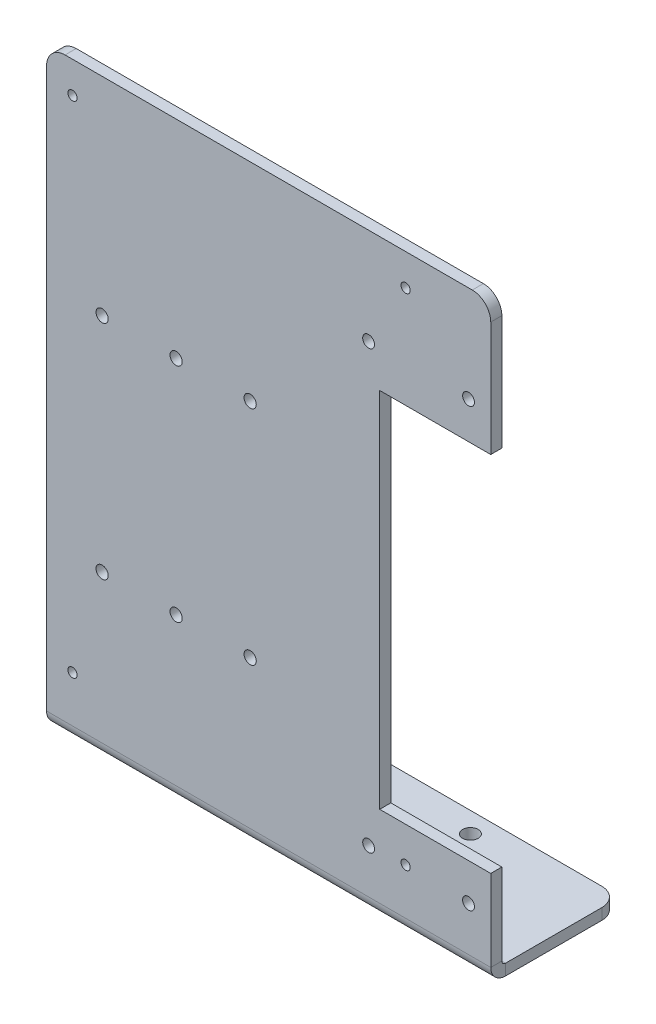
ISO-10303-21;
HEADER;
FILE_DESCRIPTION(('STEP AP214'),'2;1');
FILE_NAME('part.step','',(''),(''),'','','');
FILE_SCHEMA(('AUTOMOTIVE_DESIGN { 1 0 10303 214 1 1 1 1 }'));
ENDSEC;
DATA;
#1=APPLICATION_CONTEXT('core data for automotive mechanical design processes');
#2=APPLICATION_PROTOCOL_DEFINITION('international standard','automotive_design',2000,#1);
#3=PRODUCT_CONTEXT('',#1,'mechanical');
#4=PRODUCT('Part','Part','',(#3));
#5=PRODUCT_RELATED_PRODUCT_CATEGORY('part','',(#4));
#6=PRODUCT_DEFINITION_FORMATION('','',#4);
#7=PRODUCT_DEFINITION_CONTEXT('part definition',#1,'design');
#8=PRODUCT_DEFINITION('design','',#6,#7);
#9=PRODUCT_DEFINITION_SHAPE('','',#8);
#10=(LENGTH_UNIT() NAMED_UNIT(*) SI_UNIT(.MILLI.,.METRE.));
#11=(NAMED_UNIT(*) PLANE_ANGLE_UNIT() SI_UNIT($,.RADIAN.));
#12=(NAMED_UNIT(*) SI_UNIT($,.STERADIAN.) SOLID_ANGLE_UNIT());
#13=UNCERTAINTY_MEASURE_WITH_UNIT(LENGTH_MEASURE(1.E-05),#10,'distance_accuracy_value','');
#14=(GEOMETRIC_REPRESENTATION_CONTEXT(3) GLOBAL_UNCERTAINTY_ASSIGNED_CONTEXT((#13)) GLOBAL_UNIT_ASSIGNED_CONTEXT((#10,
#11,#12)) REPRESENTATION_CONTEXT('',''));
#15=CARTESIAN_POINT('',(0.,0.,0.));
#16=DIRECTION('',(0.,0.,1.));
#17=DIRECTION('',(1.,0.,0.));
#18=AXIS2_PLACEMENT_3D('',#15,#16,#17);
#19=CARTESIAN_POINT('',(120.,3.,-4.));
#20=DIRECTION('',(1.,0.,0.));
#21=DIRECTION('',(0.,0.,-1.));
#22=AXIS2_PLACEMENT_3D('',#19,#20,#21);
#23=PLANE('',#22);
#24=DIRECTION('',(0.,0.,1.));
#25=VECTOR('',#24,1.);
#26=CARTESIAN_POINT('',(120.,26.,-35.));
#27=LINE('',#26,#25);
#28=CARTESIAN_POINT('',(120.,26.,-3.));
#29=VERTEX_POINT('',#28);
#30=CARTESIAN_POINT('',(120.,26.,0.));
#31=VERTEX_POINT('',#30);
#32=EDGE_CURVE('E184',#29,#31,#27,.T.);
#33=ORIENTED_EDGE('',*,*,#32,.T.);
#34=DIRECTION('',(0.,1.,0.));
#35=VECTOR('',#34,1.);
#36=CARTESIAN_POINT('',(120.,0.,0.));
#37=LINE('',#36,#35);
#38=CARTESIAN_POINT('',(120.,4.,0.));
#39=VERTEX_POINT('',#38);
#40=EDGE_CURVE('E252',#39,#31,#37,.T.);
#41=ORIENTED_EDGE('',*,*,#40,.F.);
#42=DIRECTION('',(0.,0.,-1.));
#43=VECTOR('',#42,1.);
#44=CARTESIAN_POINT('',(120.,4.,0.));
#45=LINE('',#44,#43);
#46=CARTESIAN_POINT('',(120.,4.,-3.));
#47=VERTEX_POINT('',#46);
#48=EDGE_CURVE('E304',#39,#47,#45,.T.);
#49=ORIENTED_EDGE('',*,*,#48,.T.);
#50=DIRECTION('',(0.,1.,0.));
#51=VECTOR('',#50,1.);
#52=CARTESIAN_POINT('',(120.,0.,-3.));
#53=LINE('',#52,#51);
#54=EDGE_CURVE('E247',#47,#29,#53,.T.);
#55=ORIENTED_EDGE('',*,*,#54,.T.);
#56=EDGE_LOOP('',(#33,#41,#49,#55));
#57=FACE_BOUND('',#56,.T.);
#58=ADVANCED_FACE('F39',(#57),#23,.T.);
#59=CARTESIAN_POINT('',(120.,0.,-3.));
#60=DIRECTION('',(0.,0.,1.));
#61=DIRECTION('',(1.,0.,0.));
#62=AXIS2_PLACEMENT_3D('',#59,#60,#61);
#63=PLANE('',#62);
#64=CARTESIAN_POINT('',(6.99999999999999,151.5,-2.99999999999993));
#65=DIRECTION('',(0.,0.,-1.));
#66=DIRECTION('',(-1.,0.,0.));
#67=AXIS2_PLACEMENT_3D('',#64,#65,#66);
#68=CIRCLE('',#67,1.25);
#69=CARTESIAN_POINT('',(5.74999999999999,151.5,-2.99999999999993));
#70=VERTEX_POINT('',#69);
#71=EDGE_CURVE('E201',#70,#70,#68,.T.);
#72=ORIENTED_EDGE('',*,*,#71,.F.);
#73=EDGE_LOOP('',(#72));
#74=FACE_BOUND('',#73,.T.);
#75=CARTESIAN_POINT('',(35.,104.,-3.));
#76=DIRECTION('',(0.,0.,1.));
#77=DIRECTION('',(1.,0.,0.));
#78=AXIS2_PLACEMENT_3D('',#75,#76,#77);
#79=CIRCLE('',#78,1.64999999999999);
#80=CARTESIAN_POINT('',(36.65,104.,-3.));
#81=VERTEX_POINT('',#80);
#82=EDGE_CURVE('E228',#81,#81,#79,.T.);
#83=ORIENTED_EDGE('',*,*,#82,.T.);
#84=EDGE_LOOP('',(#83));
#85=FACE_BOUND('',#84,.T.);
#86=CARTESIAN_POINT('',(15.,104.,-3.));
#87=DIRECTION('',(0.,0.,1.));
#88=DIRECTION('',(1.,0.,0.));
#89=AXIS2_PLACEMENT_3D('',#86,#87,#88);
#90=CIRCLE('',#89,1.64999999999999);
#91=CARTESIAN_POINT('',(16.65,104.,-3.));
#92=VERTEX_POINT('',#91);
#93=EDGE_CURVE('E234',#92,#92,#90,.T.);
#94=ORIENTED_EDGE('',*,*,#93,.T.);
#95=EDGE_LOOP('',(#94));
#96=FACE_BOUND('',#95,.T.);
#97=DIRECTION('',(0.,1.,0.));
#98=VECTOR('',#97,1.);
#99=CARTESIAN_POINT('',(0.,0.,-3.));
#100=LINE('',#99,#98);
#101=CARTESIAN_POINT('',(0.,4.,-3.));
#102=VERTEX_POINT('',#101);
#103=CARTESIAN_POINT('',(0.,155.,-3.));
#104=VERTEX_POINT('',#103);
#105=EDGE_CURVE('E265',#102,#104,#100,.T.);
#106=ORIENTED_EDGE('',*,*,#105,.T.);
#107=CARTESIAN_POINT('',(5.,155.,-3.));
#108=DIRECTION('',(0.,0.,1.));
#109=DIRECTION('',(1.,0.,0.));
#110=AXIS2_PLACEMENT_3D('',#107,#108,#109);
#111=CIRCLE('',#110,5.);
#112=CARTESIAN_POINT('',(5.,160.,-3.));
#113=VERTEX_POINT('',#112);
#114=EDGE_CURVE('E47',#104,#113,#111,.F.);
#115=ORIENTED_EDGE('',*,*,#114,.T.);
#116=DIRECTION('',(-1.,0.,0.));
#117=VECTOR('',#116,1.);
#118=CARTESIAN_POINT('',(0.,160.,-3.));
#119=LINE('',#118,#117);
#120=CARTESIAN_POINT('',(115.,160.,-3.));
#121=VERTEX_POINT('',#120);
#122=EDGE_CURVE('E222',#121,#113,#119,.T.);
#123=ORIENTED_EDGE('',*,*,#122,.F.);
#124=CARTESIAN_POINT('',(115.,155.,-3.));
#125=DIRECTION('',(0.,0.,1.));
#126=DIRECTION('',(1.,0.,0.));
#127=AXIS2_PLACEMENT_3D('',#124,#125,#126);
#128=CIRCLE('',#127,5.);
#129=CARTESIAN_POINT('',(120.,155.,-3.));
#130=VERTEX_POINT('',#129);
#131=EDGE_CURVE('E54',#121,#130,#128,.F.);
#132=ORIENTED_EDGE('',*,*,#131,.T.);
#133=CARTESIAN_POINT('',(120.,124.,-3.));
#134=VERTEX_POINT('',#133);
#135=EDGE_CURVE('E251',#134,#130,#53,.T.);
#136=ORIENTED_EDGE('',*,*,#135,.F.);
#137=DIRECTION('',(-1.,0.,0.));
#138=VECTOR('',#137,1.);
#139=CARTESIAN_POINT('',(120.,124.,-3.));
#140=LINE('',#139,#138);
#141=CARTESIAN_POINT('',(90.,124.,-3.));
#142=VERTEX_POINT('',#141);
#143=EDGE_CURVE('E187',#134,#142,#140,.T.);
#144=ORIENTED_EDGE('',*,*,#143,.T.);
#145=DIRECTION('',(0.,-1.,0.));
#146=VECTOR('',#145,1.);
#147=CARTESIAN_POINT('',(90.,0.,-3.));
#148=LINE('',#147,#146);
#149=CARTESIAN_POINT('',(90.,26.,-3.));
#150=VERTEX_POINT('',#149);
#151=EDGE_CURVE('E162',#142,#150,#148,.T.);
#152=ORIENTED_EDGE('',*,*,#151,.T.);
#153=DIRECTION('',(1.,0.,0.));
#154=VECTOR('',#153,1.);
#155=CARTESIAN_POINT('',(120.,26.,-3.));
#156=LINE('',#155,#154);
#157=EDGE_CURVE('E192',#150,#29,#156,.T.);
#158=ORIENTED_EDGE('',*,*,#157,.T.);
#159=ORIENTED_EDGE('',*,*,#54,.F.);
#160=DIRECTION('',(-1.,0.,0.));
#161=VECTOR('',#160,1.);
#162=CARTESIAN_POINT('',(120.,4.,-3.));
#163=LINE('',#162,#161);
#164=EDGE_CURVE('E264',#47,#102,#163,.T.);
#165=ORIENTED_EDGE('',*,*,#164,.T.);
#166=EDGE_LOOP('',(#106,#115,#123,#132,#136,#144,#152,#158,#159,#165));
#167=FACE_BOUND('',#166,.T.);
#168=CARTESIAN_POINT('',(87.,134.,-3.));
#169=DIRECTION('',(0.,0.,-1.));
#170=DIRECTION('',(-1.,0.,0.));
#171=AXIS2_PLACEMENT_3D('',#168,#169,#170);
#172=CIRCLE('',#171,1.59999999999998);
#173=CARTESIAN_POINT('',(85.4,134.,-3.));
#174=VERTEX_POINT('',#173);
#175=EDGE_CURVE('E309',#174,#174,#172,.T.);
#176=ORIENTED_EDGE('',*,*,#175,.F.);
#177=EDGE_LOOP('',(#176));
#178=FACE_BOUND('',#177,.T.);
#179=CARTESIAN_POINT('',(87.,16.,-3.));
#180=DIRECTION('',(0.,0.,-1.));
#181=DIRECTION('',(-1.,0.,0.));
#182=AXIS2_PLACEMENT_3D('',#179,#180,#181);
#183=CIRCLE('',#182,1.59999999999998);
#184=CARTESIAN_POINT('',(85.4,16.,-3.));
#185=VERTEX_POINT('',#184);
#186=EDGE_CURVE('E315',#185,#185,#183,.T.);
#187=ORIENTED_EDGE('',*,*,#186,.F.);
#188=EDGE_LOOP('',(#187));
#189=FACE_BOUND('',#188,.T.);
#190=CARTESIAN_POINT('',(114.,134.,-3.));
#191=DIRECTION('',(0.,0.,-1.));
#192=DIRECTION('',(-1.,0.,0.));
#193=AXIS2_PLACEMENT_3D('',#190,#191,#192);
#194=CIRCLE('',#193,1.59999999999998);
#195=CARTESIAN_POINT('',(112.4,134.,-3.));
#196=VERTEX_POINT('',#195);
#197=EDGE_CURVE('E321',#196,#196,#194,.T.);
#198=ORIENTED_EDGE('',*,*,#197,.F.);
#199=EDGE_LOOP('',(#198));
#200=FACE_BOUND('',#199,.T.);
#201=CARTESIAN_POINT('',(114.,16.,-3.));
#202=DIRECTION('',(0.,0.,-1.));
#203=DIRECTION('',(-1.,0.,0.));
#204=AXIS2_PLACEMENT_3D('',#201,#202,#203);
#205=CIRCLE('',#204,1.59999999999998);
#206=CARTESIAN_POINT('',(112.4,16.,-3.));
#207=VERTEX_POINT('',#206);
#208=EDGE_CURVE('E327',#207,#207,#205,.T.);
#209=ORIENTED_EDGE('',*,*,#208,.F.);
#210=EDGE_LOOP('',(#209));
#211=FACE_BOUND('',#210,.T.);
#212=CARTESIAN_POINT('',(55.,104.,-3.));
#213=DIRECTION('',(0.,0.,1.));
#214=DIRECTION('',(1.,0.,0.));
#215=AXIS2_PLACEMENT_3D('',#212,#213,#214);
#216=CIRCLE('',#215,1.64999999999999);
#217=CARTESIAN_POINT('',(56.65,104.,-3.));
#218=VERTEX_POINT('',#217);
#219=EDGE_CURVE('E347',#218,#218,#216,.T.);
#220=ORIENTED_EDGE('',*,*,#219,.T.);
#221=EDGE_LOOP('',(#220));
#222=FACE_BOUND('',#221,.T.);
#223=CARTESIAN_POINT('',(15.,44.,-3.));
#224=DIRECTION('',(0.,0.,1.));
#225=DIRECTION('',(1.,0.,0.));
#226=AXIS2_PLACEMENT_3D('',#223,#224,#225);
#227=CIRCLE('',#226,1.64999999999999);
#228=CARTESIAN_POINT('',(16.65,44.,-3.));
#229=VERTEX_POINT('',#228);
#230=EDGE_CURVE('E353',#229,#229,#227,.T.);
#231=ORIENTED_EDGE('',*,*,#230,.T.);
#232=EDGE_LOOP('',(#231));
#233=FACE_BOUND('',#232,.T.);
#234=CARTESIAN_POINT('',(35.,44.,-3.));
#235=DIRECTION('',(0.,0.,1.));
#236=DIRECTION('',(1.,0.,0.));
#237=AXIS2_PLACEMENT_3D('',#234,#235,#236);
#238=CIRCLE('',#237,1.64999999999999);
#239=CARTESIAN_POINT('',(36.65,44.,-3.));
#240=VERTEX_POINT('',#239);
#241=EDGE_CURVE('E359',#240,#240,#238,.T.);
#242=ORIENTED_EDGE('',*,*,#241,.T.);
#243=EDGE_LOOP('',(#242));
#244=FACE_BOUND('',#243,.T.);
#245=CARTESIAN_POINT('',(55.,44.,-3.));
#246=DIRECTION('',(0.,0.,1.));
#247=DIRECTION('',(1.,0.,0.));
#248=AXIS2_PLACEMENT_3D('',#245,#246,#247);
#249=CIRCLE('',#248,1.64999999999999);
#250=CARTESIAN_POINT('',(56.65,44.,-3.));
#251=VERTEX_POINT('',#250);
#252=EDGE_CURVE('E365',#251,#251,#249,.T.);
#253=ORIENTED_EDGE('',*,*,#252,.T.);
#254=EDGE_LOOP('',(#253));
#255=FACE_BOUND('',#254,.T.);
#256=CARTESIAN_POINT('',(6.99999999999999,16.5,-2.99999999999996));
#257=DIRECTION('',(0.,0.,-1.));
#258=DIRECTION('',(-1.,0.,0.));
#259=AXIS2_PLACEMENT_3D('',#256,#257,#258);
#260=CIRCLE('',#259,1.25);
#261=CARTESIAN_POINT('',(5.74999999999999,16.5,-2.99999999999996));
#262=VERTEX_POINT('',#261);
#263=EDGE_CURVE('E213',#262,#262,#260,.T.);
#264=ORIENTED_EDGE('',*,*,#263,.F.);
#265=EDGE_LOOP('',(#264));
#266=FACE_BOUND('',#265,.T.);
#267=CARTESIAN_POINT('',(97.,16.5,-2.99999999999996));
#268=DIRECTION('',(0.,0.,-1.));
#269=DIRECTION('',(-1.,0.,0.));
#270=AXIS2_PLACEMENT_3D('',#267,#268,#269);
#271=CIRCLE('',#270,1.25);
#272=CARTESIAN_POINT('',(95.75,16.5,-2.99999999999996));
#273=VERTEX_POINT('',#272);
#274=EDGE_CURVE('E207',#273,#273,#271,.T.);
#275=ORIENTED_EDGE('',*,*,#274,.F.);
#276=EDGE_LOOP('',(#275));
#277=FACE_BOUND('',#276,.T.);
#278=CARTESIAN_POINT('',(97.,151.5,-2.99999999999989));
#279=DIRECTION('',(0.,0.,-1.));
#280=DIRECTION('',(-1.,0.,0.));
#281=AXIS2_PLACEMENT_3D('',#278,#279,#280);
#282=CIRCLE('',#281,1.25);
#283=CARTESIAN_POINT('',(95.75,151.5,-2.99999999999989));
#284=VERTEX_POINT('',#283);
#285=EDGE_CURVE('E195',#284,#284,#282,.T.);
#286=ORIENTED_EDGE('',*,*,#285,.F.);
#287=EDGE_LOOP('',(#286));
#288=FACE_BOUND('',#287,.T.);
#289=ADVANCED_FACE('F398',(#74,#85,#96,#167,#178,#189,#200,#211,#222,#233,#244,#255,#266,#277,
#288),#63,.F.);
#290=CARTESIAN_POINT('',(55.,44.,0.));
#291=DIRECTION('',(0.,0.,1.));
#292=DIRECTION('',(1.,0.,0.));
#293=AXIS2_PLACEMENT_3D('',#290,#291,#292);
#294=CYLINDRICAL_SURFACE('',#293,1.64999999999999);
#295=CARTESIAN_POINT('',(55.,44.,0.));
#296=DIRECTION('',(0.,0.,1.));
#297=DIRECTION('',(1.,0.,0.));
#298=AXIS2_PLACEMENT_3D('',#295,#296,#297);
#299=CIRCLE('',#298,1.64999999999999);
#300=CARTESIAN_POINT('',(56.65,44.,0.));
#301=VERTEX_POINT('',#300);
#302=EDGE_CURVE('E362',#301,#301,#299,.T.);
#303=ORIENTED_EDGE('',*,*,#302,.T.);
#304=EDGE_LOOP('',(#303));
#305=FACE_BOUND('',#304,.T.);
#306=ORIENTED_EDGE('',*,*,#252,.F.);
#307=EDGE_LOOP('',(#306));
#308=FACE_BOUND('',#307,.T.);
#309=ADVANCED_FACE('F436',(#305,#308),#294,.F.);
#310=CARTESIAN_POINT('',(35.,44.,0.));
#311=DIRECTION('',(0.,0.,1.));
#312=DIRECTION('',(1.,0.,0.));
#313=AXIS2_PLACEMENT_3D('',#310,#311,#312);
#314=CYLINDRICAL_SURFACE('',#313,1.64999999999999);
#315=CARTESIAN_POINT('',(35.,44.,0.));
#316=DIRECTION('',(0.,0.,1.));
#317=DIRECTION('',(1.,0.,0.));
#318=AXIS2_PLACEMENT_3D('',#315,#316,#317);
#319=CIRCLE('',#318,1.64999999999999);
#320=CARTESIAN_POINT('',(36.65,44.,0.));
#321=VERTEX_POINT('',#320);
#322=EDGE_CURVE('E356',#321,#321,#319,.T.);
#323=ORIENTED_EDGE('',*,*,#322,.T.);
#324=EDGE_LOOP('',(#323));
#325=FACE_BOUND('',#324,.T.);
#326=ORIENTED_EDGE('',*,*,#241,.F.);
#327=EDGE_LOOP('',(#326));
#328=FACE_BOUND('',#327,.T.);
#329=ADVANCED_FACE('F484',(#325,#328),#314,.F.);
#330=CARTESIAN_POINT('',(15.,44.,0.));
#331=DIRECTION('',(0.,0.,1.));
#332=DIRECTION('',(1.,0.,0.));
#333=AXIS2_PLACEMENT_3D('',#330,#331,#332);
#334=CYLINDRICAL_SURFACE('',#333,1.64999999999999);
#335=CARTESIAN_POINT('',(15.,44.,0.));
#336=DIRECTION('',(0.,0.,1.));
#337=DIRECTION('',(1.,0.,0.));
#338=AXIS2_PLACEMENT_3D('',#335,#336,#337);
#339=CIRCLE('',#338,1.64999999999999);
#340=CARTESIAN_POINT('',(16.65,44.,0.));
#341=VERTEX_POINT('',#340);
#342=EDGE_CURVE('E350',#341,#341,#339,.T.);
#343=ORIENTED_EDGE('',*,*,#342,.T.);
#344=EDGE_LOOP('',(#343));
#345=FACE_BOUND('',#344,.T.);
#346=ORIENTED_EDGE('',*,*,#230,.F.);
#347=EDGE_LOOP('',(#346));
#348=FACE_BOUND('',#347,.T.);
#349=ADVANCED_FACE('F480',(#345,#348),#334,.F.);
#350=CARTESIAN_POINT('',(55.,104.,0.));
#351=DIRECTION('',(0.,0.,1.));
#352=DIRECTION('',(1.,0.,0.));
#353=AXIS2_PLACEMENT_3D('',#350,#351,#352);
#354=CYLINDRICAL_SURFACE('',#353,1.64999999999999);
#355=CARTESIAN_POINT('',(55.,104.,0.));
#356=DIRECTION('',(0.,0.,1.));
#357=DIRECTION('',(1.,0.,0.));
#358=AXIS2_PLACEMENT_3D('',#355,#356,#357);
#359=CIRCLE('',#358,1.64999999999999);
#360=CARTESIAN_POINT('',(56.65,104.,0.));
#361=VERTEX_POINT('',#360);
#362=EDGE_CURVE('E344',#361,#361,#359,.T.);
#363=ORIENTED_EDGE('',*,*,#362,.T.);
#364=EDGE_LOOP('',(#363));
#365=FACE_BOUND('',#364,.T.);
#366=ORIENTED_EDGE('',*,*,#219,.F.);
#367=EDGE_LOOP('',(#366));
#368=FACE_BOUND('',#367,.T.);
#369=ADVANCED_FACE('F476',(#365,#368),#354,.F.);
#370=CARTESIAN_POINT('',(85.,140.,-29.5));
#371=DIRECTION('',(0.,-1.,0.));
#372=DIRECTION('',(0.,0.,-1.));
#373=AXIS2_PLACEMENT_3D('',#370,#371,#372);
#374=CYLINDRICAL_SURFACE('',#373,2.1);
#375=CARTESIAN_POINT('',(85.,0.,-29.5));
#376=DIRECTION('',(0.,-1.,0.));
#377=DIRECTION('',(0.,0.,-1.));
#378=AXIS2_PLACEMENT_3D('',#375,#376,#377);
#379=CIRCLE('',#378,2.1);
#380=CARTESIAN_POINT('',(85.,0.,-31.6));
#381=VERTEX_POINT('',#380);
#382=EDGE_CURVE('E338',#381,#381,#379,.T.);
#383=ORIENTED_EDGE('',*,*,#382,.T.);
#384=EDGE_LOOP('',(#383));
#385=FACE_BOUND('',#384,.T.);
#386=CARTESIAN_POINT('',(85.,3.,-29.5));
#387=DIRECTION('',(0.,-1.,0.));
#388=DIRECTION('',(0.,0.,-1.));
#389=AXIS2_PLACEMENT_3D('',#386,#387,#388);
#390=CIRCLE('',#389,2.1);
#391=CARTESIAN_POINT('',(85.,3.,-31.6));
#392=VERTEX_POINT('',#391);
#393=EDGE_CURVE('E341',#392,#392,#390,.T.);
#394=ORIENTED_EDGE('',*,*,#393,.F.);
#395=EDGE_LOOP('',(#394));
#396=FACE_BOUND('',#395,.T.);
#397=ADVANCED_FACE('F472',(#385,#396),#374,.F.);
#398=CARTESIAN_POINT('',(85.,140.,-9.49999999999999));
#399=DIRECTION('',(0.,-1.,0.));
#400=DIRECTION('',(0.,0.,-1.));
#401=AXIS2_PLACEMENT_3D('',#398,#399,#400);
#402=CYLINDRICAL_SURFACE('',#401,2.1);
#403=CARTESIAN_POINT('',(85.,0.,-9.5));
#404=DIRECTION('',(0.,-1.,0.));
#405=DIRECTION('',(0.,0.,-1.));
#406=AXIS2_PLACEMENT_3D('',#403,#404,#405);
#407=CIRCLE('',#406,2.1);
#408=CARTESIAN_POINT('',(85.,0.,-11.6));
#409=VERTEX_POINT('',#408);
#410=EDGE_CURVE('E330',#409,#409,#407,.T.);
#411=ORIENTED_EDGE('',*,*,#410,.T.);
#412=EDGE_LOOP('',(#411));
#413=FACE_BOUND('',#412,.T.);
#414=CARTESIAN_POINT('',(85.,3.,-9.5));
#415=DIRECTION('',(0.,-1.,0.));
#416=DIRECTION('',(0.,0.,-1.));
#417=AXIS2_PLACEMENT_3D('',#414,#415,#416);
#418=CIRCLE('',#417,2.1);
#419=CARTESIAN_POINT('',(85.,3.,-11.6));
#420=VERTEX_POINT('',#419);
#421=EDGE_CURVE('E335',#420,#420,#418,.T.);
#422=ORIENTED_EDGE('',*,*,#421,.F.);
#423=EDGE_LOOP('',(#422));
#424=FACE_BOUND('',#423,.T.);
#425=ADVANCED_FACE('F468',(#413,#424),#402,.F.);
#426=CARTESIAN_POINT('',(114.,16.,0.));
#427=DIRECTION('',(0.,0.,-1.));
#428=DIRECTION('',(-1.,0.,0.));
#429=AXIS2_PLACEMENT_3D('',#426,#427,#428);
#430=CYLINDRICAL_SURFACE('',#429,1.59999999999998);
#431=CARTESIAN_POINT('',(114.,16.,0.));
#432=DIRECTION('',(0.,0.,-1.));
#433=DIRECTION('',(-1.,0.,0.));
#434=AXIS2_PLACEMENT_3D('',#431,#432,#433);
#435=CIRCLE('',#434,1.59999999999998);
#436=CARTESIAN_POINT('',(112.4,16.,0.));
#437=VERTEX_POINT('',#436);
#438=EDGE_CURVE('E324',#437,#437,#435,.T.);
#439=ORIENTED_EDGE('',*,*,#438,.F.);
#440=EDGE_LOOP('',(#439));
#441=FACE_BOUND('',#440,.T.);
#442=ORIENTED_EDGE('',*,*,#208,.T.);
#443=EDGE_LOOP('',(#442));
#444=FACE_BOUND('',#443,.T.);
#445=ADVANCED_FACE('F464',(#441,#444),#430,.F.);
#446=CARTESIAN_POINT('',(114.,134.,0.));
#447=DIRECTION('',(0.,0.,-1.));
#448=DIRECTION('',(-1.,0.,0.));
#449=AXIS2_PLACEMENT_3D('',#446,#447,#448);
#450=CYLINDRICAL_SURFACE('',#449,1.59999999999998);
#451=CARTESIAN_POINT('',(114.,134.,0.));
#452=DIRECTION('',(0.,0.,-1.));
#453=DIRECTION('',(-1.,0.,0.));
#454=AXIS2_PLACEMENT_3D('',#451,#452,#453);
#455=CIRCLE('',#454,1.59999999999998);
#456=CARTESIAN_POINT('',(112.4,134.,0.));
#457=VERTEX_POINT('',#456);
#458=EDGE_CURVE('E318',#457,#457,#455,.T.);
#459=ORIENTED_EDGE('',*,*,#458,.F.);
#460=EDGE_LOOP('',(#459));
#461=FACE_BOUND('',#460,.T.);
#462=ORIENTED_EDGE('',*,*,#197,.T.);
#463=EDGE_LOOP('',(#462));
#464=FACE_BOUND('',#463,.T.);
#465=ADVANCED_FACE('F460',(#461,#464),#450,.F.);
#466=CARTESIAN_POINT('',(87.,16.,0.));
#467=DIRECTION('',(0.,0.,-1.));
#468=DIRECTION('',(-1.,0.,0.));
#469=AXIS2_PLACEMENT_3D('',#466,#467,#468);
#470=CYLINDRICAL_SURFACE('',#469,1.59999999999998);
#471=CARTESIAN_POINT('',(87.,16.,0.));
#472=DIRECTION('',(0.,0.,-1.));
#473=DIRECTION('',(-1.,0.,0.));
#474=AXIS2_PLACEMENT_3D('',#471,#472,#473);
#475=CIRCLE('',#474,1.59999999999998);
#476=CARTESIAN_POINT('',(85.4,16.,0.));
#477=VERTEX_POINT('',#476);
#478=EDGE_CURVE('E312',#477,#477,#475,.T.);
#479=ORIENTED_EDGE('',*,*,#478,.F.);
#480=EDGE_LOOP('',(#479));
#481=FACE_BOUND('',#480,.T.);
#482=ORIENTED_EDGE('',*,*,#186,.T.);
#483=EDGE_LOOP('',(#482));
#484=FACE_BOUND('',#483,.T.);
#485=ADVANCED_FACE('F454',(#481,#484),#470,.F.);
#486=CARTESIAN_POINT('',(87.,134.,0.));
#487=DIRECTION('',(0.,0.,-1.));
#488=DIRECTION('',(-1.,0.,0.));
#489=AXIS2_PLACEMENT_3D('',#486,#487,#488);
#490=CYLINDRICAL_SURFACE('',#489,1.59999999999998);
#491=CARTESIAN_POINT('',(87.,134.,0.));
#492=DIRECTION('',(0.,0.,-1.));
#493=DIRECTION('',(-1.,0.,0.));
#494=AXIS2_PLACEMENT_3D('',#491,#492,#493);
#495=CIRCLE('',#494,1.59999999999998);
#496=CARTESIAN_POINT('',(85.4,134.,0.));
#497=VERTEX_POINT('',#496);
#498=EDGE_CURVE('E306',#497,#497,#495,.T.);
#499=ORIENTED_EDGE('',*,*,#498,.F.);
#500=EDGE_LOOP('',(#499));
#501=FACE_BOUND('',#500,.T.);
#502=ORIENTED_EDGE('',*,*,#175,.T.);
#503=EDGE_LOOP('',(#502));
#504=FACE_BOUND('',#503,.T.);
#505=ADVANCED_FACE('F449',(#501,#504),#490,.F.);
#506=CARTESIAN_POINT('',(120.,4.,0.));
#507=DIRECTION('',(1.,0.,0.));
#508=DIRECTION('',(0.,0.,-1.));
#509=AXIS2_PLACEMENT_3D('',#506,#507,#508);
#510=PLANE('',#509);
#511=ORIENTED_EDGE('',*,*,#48,.F.);
#512=CARTESIAN_POINT('',(120.,4.,-4.));
#513=DIRECTION('',(1.,0.,0.));
#514=DIRECTION('',(0.,0.,-1.));
#515=AXIS2_PLACEMENT_3D('',#512,#513,#514);
#516=CIRCLE('',#515,4.);
#517=CARTESIAN_POINT('',(120.,0.,-4.));
#518=VERTEX_POINT('',#517);
#519=EDGE_CURVE('E254',#518,#39,#516,.F.);
#520=ORIENTED_EDGE('',*,*,#519,.F.);
#521=DIRECTION('',(0.,-1.,0.));
#522=VECTOR('',#521,1.);
#523=CARTESIAN_POINT('',(120.,3.,-4.));
#524=LINE('',#523,#522);
#525=CARTESIAN_POINT('',(120.,3.,-4.));
#526=VERTEX_POINT('',#525);
#527=EDGE_CURVE('E301',#526,#518,#524,.T.);
#528=ORIENTED_EDGE('',*,*,#527,.F.);
#529=CARTESIAN_POINT('',(120.,4.,-4.));
#530=DIRECTION('',(1.,0.,0.));
#531=DIRECTION('',(0.,0.,-1.));
#532=AXIS2_PLACEMENT_3D('',#529,#530,#531);
#533=CIRCLE('',#532,1.);
#534=EDGE_CURVE('E261',#526,#47,#533,.F.);
#535=ORIENTED_EDGE('',*,*,#534,.T.);
#536=EDGE_LOOP('',(#511,#520,#528,#535));
#537=FACE_BOUND('',#536,.T.);
#538=ADVANCED_FACE('F443',(#537),#510,.T.);
#539=ORIENTED_EDGE('',*,*,#135,.T.);
#540=DIRECTION('',(0.,0.,-1.));
#541=VECTOR('',#540,1.);
#542=CARTESIAN_POINT('',(120.,155.,0.));
#543=LINE('',#542,#541);
#544=CARTESIAN_POINT('',(120.,155.,0.));
#545=VERTEX_POINT('',#544);
#546=EDGE_CURVE('E11',#130,#545,#543,.F.);
#547=ORIENTED_EDGE('',*,*,#546,.T.);
#548=CARTESIAN_POINT('',(120.,124.,0.));
#549=VERTEX_POINT('',#548);
#550=EDGE_CURVE('E250',#549,#545,#37,.T.);
#551=ORIENTED_EDGE('',*,*,#550,.F.);
#552=DIRECTION('',(0.,0.,1.));
#553=VECTOR('',#552,1.);
#554=CARTESIAN_POINT('',(120.,124.,-35.));
#555=LINE('',#554,#553);
#556=EDGE_CURVE('E166',#134,#549,#555,.T.);
#557=ORIENTED_EDGE('',*,*,#556,.F.);
#558=EDGE_LOOP('',(#539,#547,#551,#557));
#559=FACE_BOUND('',#558,.T.);
#560=ADVANCED_FACE('F422',(#559),#23,.T.);
#561=CARTESIAN_POINT('',(0.,0.,-4.));
#562=DIRECTION('',(-1.,0.,0.));
#563=DIRECTION('',(0.,0.,1.));
#564=AXIS2_PLACEMENT_3D('',#561,#562,#563);
#565=PLANE('',#564);
#566=DIRECTION('',(0.,1.,0.));
#567=VECTOR('',#566,1.);
#568=CARTESIAN_POINT('',(0.,0.,-4.));
#569=LINE('',#568,#567);
#570=CARTESIAN_POINT('',(0.,0.,-4.));
#571=VERTEX_POINT('',#570);
#572=CARTESIAN_POINT('',(0.,3.,-4.));
#573=VERTEX_POINT('',#572);
#574=EDGE_CURVE('E298',#571,#573,#569,.T.);
#575=ORIENTED_EDGE('',*,*,#574,.F.);
#576=CARTESIAN_POINT('',(0.,4.,-4.));
#577=DIRECTION('',(1.,0.,0.));
#578=DIRECTION('',(0.,0.,-1.));
#579=AXIS2_PLACEMENT_3D('',#576,#577,#578);
#580=CIRCLE('',#579,4.);
#581=CARTESIAN_POINT('',(0.,4.,0.));
#582=VERTEX_POINT('',#581);
#583=EDGE_CURVE('E269',#571,#582,#580,.F.);
#584=ORIENTED_EDGE('',*,*,#583,.T.);
#585=DIRECTION('',(0.,0.,1.));
#586=VECTOR('',#585,1.);
#587=CARTESIAN_POINT('',(0.,4.,-3.));
#588=LINE('',#587,#586);
#589=EDGE_CURVE('E296',#102,#582,#588,.T.);
#590=ORIENTED_EDGE('',*,*,#589,.F.);
#591=CARTESIAN_POINT('',(0.,4.,-4.));
#592=DIRECTION('',(1.,0.,0.));
#593=DIRECTION('',(0.,0.,-1.));
#594=AXIS2_PLACEMENT_3D('',#591,#592,#593);
#595=CIRCLE('',#594,1.);
#596=EDGE_CURVE('E276',#573,#102,#595,.F.);
#597=ORIENTED_EDGE('',*,*,#596,.F.);
#598=EDGE_LOOP('',(#575,#584,#590,#597));
#599=FACE_BOUND('',#598,.T.);
#600=ADVANCED_FACE('F442',(#599),#565,.T.);
#601=CARTESIAN_POINT('',(0.,4.,-3.));
#602=DIRECTION('',(-1.,0.,0.));
#603=DIRECTION('',(0.,0.,1.));
#604=AXIS2_PLACEMENT_3D('',#601,#602,#603);
#605=PLANE('',#604);
#606=DIRECTION('',(0.,0.,1.));
#607=VECTOR('',#606,1.);
#608=CARTESIAN_POINT('',(0.,3.,-35.));
#609=LINE('',#608,#607);
#610=CARTESIAN_POINT('',(0.,3.,-30.));
#611=VERTEX_POINT('',#610);
#612=EDGE_CURVE('E274',#611,#573,#609,.T.);
#613=ORIENTED_EDGE('',*,*,#612,.F.);
#614=DIRECTION('',(0.,-1.,0.));
#615=VECTOR('',#614,1.);
#616=CARTESIAN_POINT('',(0.,4.,-30.));
#617=LINE('',#616,#615);
#618=CARTESIAN_POINT('',(0.,0.,-30.));
#619=VERTEX_POINT('',#618);
#620=EDGE_CURVE('E368',#611,#619,#617,.T.);
#621=ORIENTED_EDGE('',*,*,#620,.T.);
#622=DIRECTION('',(0.,0.,1.));
#623=VECTOR('',#622,1.);
#624=CARTESIAN_POINT('',(0.,0.,-35.));
#625=LINE('',#624,#623);
#626=EDGE_CURVE('E272',#619,#571,#625,.T.);
#627=ORIENTED_EDGE('',*,*,#626,.T.);
#628=ORIENTED_EDGE('',*,*,#574,.T.);
#629=EDGE_LOOP('',(#613,#621,#627,#628));
#630=FACE_BOUND('',#629,.T.);
#631=ADVANCED_FACE('F448',(#630),#605,.T.);
#632=CARTESIAN_POINT('',(120.,0.,0.));
#633=DIRECTION('',(0.,0.,1.));
#634=DIRECTION('',(1.,0.,0.));
#635=AXIS2_PLACEMENT_3D('',#632,#633,#634);
#636=PLANE('',#635);
#637=DIRECTION('',(1.,0.,0.));
#638=VECTOR('',#637,1.);
#639=CARTESIAN_POINT('',(0.,160.,0.));
#640=LINE('',#639,#638);
#641=CARTESIAN_POINT('',(5.,160.,0.));
#642=VERTEX_POINT('',#641);
#643=CARTESIAN_POINT('',(115.,160.,0.));
#644=VERTEX_POINT('',#643);
#645=EDGE_CURVE('E219',#642,#644,#640,.T.);
#646=ORIENTED_EDGE('',*,*,#645,.F.);
#647=CARTESIAN_POINT('',(5.,155.,0.));
#648=DIRECTION('',(0.,0.,1.));
#649=DIRECTION('',(1.,0.,0.));
#650=AXIS2_PLACEMENT_3D('',#647,#648,#649);
#651=CIRCLE('',#650,5.);
#652=CARTESIAN_POINT('',(0.,155.,0.));
#653=VERTEX_POINT('',#652);
#654=EDGE_CURVE('E394',#642,#653,#651,.T.);
#655=ORIENTED_EDGE('',*,*,#654,.T.);
#656=DIRECTION('',(0.,1.,0.));
#657=VECTOR('',#656,1.);
#658=CARTESIAN_POINT('',(0.,0.,0.));
#659=LINE('',#658,#657);
#660=EDGE_CURVE('E267',#582,#653,#659,.T.);
#661=ORIENTED_EDGE('',*,*,#660,.F.);
#662=DIRECTION('',(-1.,0.,0.));
#663=VECTOR('',#662,1.);
#664=CARTESIAN_POINT('',(120.,4.,0.));
#665=LINE('',#664,#663);
#666=EDGE_CURVE('E293',#39,#582,#665,.T.);
#667=ORIENTED_EDGE('',*,*,#666,.F.);
#668=ORIENTED_EDGE('',*,*,#40,.T.);
#669=DIRECTION('',(1.,0.,0.));
#670=VECTOR('',#669,1.);
#671=CARTESIAN_POINT('',(120.,26.,0.));
#672=LINE('',#671,#670);
#673=CARTESIAN_POINT('',(90.,26.,0.));
#674=VERTEX_POINT('',#673);
#675=EDGE_CURVE('E180',#674,#31,#672,.T.);
#676=ORIENTED_EDGE('',*,*,#675,.F.);
#677=DIRECTION('',(0.,-1.,0.));
#678=VECTOR('',#677,1.);
#679=CARTESIAN_POINT('',(90.,124.,0.));
#680=LINE('',#679,#678);
#681=CARTESIAN_POINT('',(90.,124.,0.));
#682=VERTEX_POINT('',#681);
#683=EDGE_CURVE('E159',#682,#674,#680,.T.);
#684=ORIENTED_EDGE('',*,*,#683,.F.);
#685=DIRECTION('',(-1.,0.,0.));
#686=VECTOR('',#685,1.);
#687=CARTESIAN_POINT('',(120.,124.,0.));
#688=LINE('',#687,#686);
#689=EDGE_CURVE('E169',#549,#682,#688,.T.);
#690=ORIENTED_EDGE('',*,*,#689,.F.);
#691=ORIENTED_EDGE('',*,*,#550,.T.);
#692=CARTESIAN_POINT('',(115.,155.,0.));
#693=DIRECTION('',(0.,0.,1.));
#694=DIRECTION('',(1.,0.,0.));
#695=AXIS2_PLACEMENT_3D('',#692,#693,#694);
#696=CIRCLE('',#695,5.);
#697=EDGE_CURVE('E392',#545,#644,#696,.T.);
#698=ORIENTED_EDGE('',*,*,#697,.T.);
#699=EDGE_LOOP('',(#646,#655,#661,#667,#668,#676,#684,#690,#691,#698));
#700=FACE_BOUND('',#699,.T.);
#701=CARTESIAN_POINT('',(97.,151.5,0.));
#702=DIRECTION('',(0.,0.,1.));
#703=DIRECTION('',(1.,0.,0.));
#704=AXIS2_PLACEMENT_3D('',#701,#702,#703);
#705=CIRCLE('',#704,1.25);
#706=CARTESIAN_POINT('',(98.25,151.5,0.));
#707=VERTEX_POINT('',#706);
#708=EDGE_CURVE('E198',#707,#707,#705,.T.);
#709=ORIENTED_EDGE('',*,*,#708,.F.);
#710=EDGE_LOOP('',(#709));
#711=FACE_BOUND('',#710,.T.);
#712=CARTESIAN_POINT('',(6.99999999999999,151.5,0.));
#713=DIRECTION('',(0.,0.,1.));
#714=DIRECTION('',(1.,0.,0.));
#715=AXIS2_PLACEMENT_3D('',#712,#713,#714);
#716=CIRCLE('',#715,1.25);
#717=CARTESIAN_POINT('',(8.24999999999999,151.5,0.));
#718=VERTEX_POINT('',#717);
#719=EDGE_CURVE('E204',#718,#718,#716,.T.);
#720=ORIENTED_EDGE('',*,*,#719,.F.);
#721=EDGE_LOOP('',(#720));
#722=FACE_BOUND('',#721,.T.);
#723=CARTESIAN_POINT('',(97.,16.5,0.));
#724=DIRECTION('',(0.,0.,1.));
#725=DIRECTION('',(1.,0.,0.));
#726=AXIS2_PLACEMENT_3D('',#723,#724,#725);
#727=CIRCLE('',#726,1.25);
#728=CARTESIAN_POINT('',(98.25,16.5,0.));
#729=VERTEX_POINT('',#728);
#730=EDGE_CURVE('E210',#729,#729,#727,.T.);
#731=ORIENTED_EDGE('',*,*,#730,.F.);
#732=EDGE_LOOP('',(#731));
#733=FACE_BOUND('',#732,.T.);
#734=CARTESIAN_POINT('',(6.99999999999999,16.5,0.));
#735=DIRECTION('',(0.,0.,1.));
#736=DIRECTION('',(1.,0.,0.));
#737=AXIS2_PLACEMENT_3D('',#734,#735,#736);
#738=CIRCLE('',#737,1.25);
#739=CARTESIAN_POINT('',(8.24999999999999,16.5,0.));
#740=VERTEX_POINT('',#739);
#741=EDGE_CURVE('E216',#740,#740,#738,.T.);
#742=ORIENTED_EDGE('',*,*,#741,.F.);
#743=EDGE_LOOP('',(#742));
#744=FACE_BOUND('',#743,.T.);
#745=CARTESIAN_POINT('',(35.,104.,0.));
#746=DIRECTION('',(0.,0.,1.));
#747=DIRECTION('',(1.,0.,0.));
#748=AXIS2_PLACEMENT_3D('',#745,#746,#747);
#749=CIRCLE('',#748,1.64999999999999);
#750=CARTESIAN_POINT('',(36.65,104.,0.));
#751=VERTEX_POINT('',#750);
#752=EDGE_CURVE('E225',#751,#751,#749,.T.);
#753=ORIENTED_EDGE('',*,*,#752,.F.);
#754=EDGE_LOOP('',(#753));
#755=FACE_BOUND('',#754,.T.);
#756=CARTESIAN_POINT('',(15.,104.,0.));
#757=DIRECTION('',(0.,0.,1.));
#758=DIRECTION('',(1.,0.,0.));
#759=AXIS2_PLACEMENT_3D('',#756,#757,#758);
#760=CIRCLE('',#759,1.64999999999999);
#761=CARTESIAN_POINT('',(16.65,104.,0.));
#762=VERTEX_POINT('',#761);
#763=EDGE_CURVE('E231',#762,#762,#760,.T.);
#764=ORIENTED_EDGE('',*,*,#763,.F.);
#765=EDGE_LOOP('',(#764));
#766=FACE_BOUND('',#765,.T.);
#767=ORIENTED_EDGE('',*,*,#498,.T.);
#768=EDGE_LOOP('',(#767));
#769=FACE_BOUND('',#768,.T.);
#770=ORIENTED_EDGE('',*,*,#478,.T.);
#771=EDGE_LOOP('',(#770));
#772=FACE_BOUND('',#771,.T.);
#773=ORIENTED_EDGE('',*,*,#458,.T.);
#774=EDGE_LOOP('',(#773));
#775=FACE_BOUND('',#774,.T.);
#776=ORIENTED_EDGE('',*,*,#438,.T.);
#777=EDGE_LOOP('',(#776));
#778=FACE_BOUND('',#777,.T.);
#779=ORIENTED_EDGE('',*,*,#362,.F.);
#780=EDGE_LOOP('',(#779));
#781=FACE_BOUND('',#780,.T.);
#782=ORIENTED_EDGE('',*,*,#342,.F.);
#783=EDGE_LOOP('',(#782));
#784=FACE_BOUND('',#783,.T.);
#785=ORIENTED_EDGE('',*,*,#322,.F.);
#786=EDGE_LOOP('',(#785));
#787=FACE_BOUND('',#786,.T.);
#788=ORIENTED_EDGE('',*,*,#302,.F.);
#789=EDGE_LOOP('',(#788));
#790=FACE_BOUND('',#789,.T.);
#791=ADVANCED_FACE('F177',(#700,#711,#722,#733,#744,#755,#766,#769,#772,#775,#778,#781,#784,
#787,#790),#636,.T.);
#792=CARTESIAN_POINT('',(120.,4.,-4.));
#793=DIRECTION('',(-1.,0.,0.));
#794=DIRECTION('',(0.,0.,1.));
#795=AXIS2_PLACEMENT_3D('',#792,#793,#794);
#796=CYLINDRICAL_SURFACE('',#795,4.);
#797=ORIENTED_EDGE('',*,*,#583,.F.);
#798=DIRECTION('',(-1.,0.,0.));
#799=VECTOR('',#798,1.);
#800=CARTESIAN_POINT('',(120.,0.,-4.));
#801=LINE('',#800,#799);
#802=EDGE_CURVE('E290',#518,#571,#801,.T.);
#803=ORIENTED_EDGE('',*,*,#802,.F.);
#804=ORIENTED_EDGE('',*,*,#519,.T.);
#805=ORIENTED_EDGE('',*,*,#666,.T.);
#806=EDGE_LOOP('',(#797,#803,#804,#805));
#807=FACE_BOUND('',#806,.T.);
#808=ADVANCED_FACE('F413',(#807),#796,.T.);
#809=CARTESIAN_POINT('',(120.,0.,-35.));
#810=DIRECTION('',(0.,-1.,0.));
#811=DIRECTION('',(0.,0.,-1.));
#812=AXIS2_PLACEMENT_3D('',#809,#810,#811);
#813=PLANE('',#812);
#814=CARTESIAN_POINT('',(35.,0.,-29.5));
#815=DIRECTION('',(0.,-1.,0.));
#816=DIRECTION('',(0.,0.,-1.));
#817=AXIS2_PLACEMENT_3D('',#814,#815,#816);
#818=CIRCLE('',#817,2.1);
#819=CARTESIAN_POINT('',(35.,0.,-31.6));
#820=VERTEX_POINT('',#819);
#821=EDGE_CURVE('E237',#820,#820,#818,.T.);
#822=ORIENTED_EDGE('',*,*,#821,.F.);
#823=EDGE_LOOP('',(#822));
#824=FACE_BOUND('',#823,.T.);
#825=CARTESIAN_POINT('',(35.,0.,-9.5));
#826=DIRECTION('',(0.,-1.,0.));
#827=DIRECTION('',(0.,0.,-1.));
#828=AXIS2_PLACEMENT_3D('',#825,#826,#827);
#829=CIRCLE('',#828,2.1);
#830=CARTESIAN_POINT('',(35.,0.,-11.6));
#831=VERTEX_POINT('',#830);
#832=EDGE_CURVE('E243',#831,#831,#829,.T.);
#833=ORIENTED_EDGE('',*,*,#832,.F.);
#834=EDGE_LOOP('',(#833));
#835=FACE_BOUND('',#834,.T.);
#836=ORIENTED_EDGE('',*,*,#626,.F.);
#837=CARTESIAN_POINT('',(5.,0.,-30.));
#838=DIRECTION('',(0.,-1.,0.));
#839=DIRECTION('',(0.,0.,-1.));
#840=AXIS2_PLACEMENT_3D('',#837,#838,#839);
#841=CIRCLE('',#840,5.);
#842=CARTESIAN_POINT('',(5.,0.,-35.));
#843=VERTEX_POINT('',#842);
#844=EDGE_CURVE('E373',#619,#843,#841,.T.);
#845=ORIENTED_EDGE('',*,*,#844,.T.);
#846=DIRECTION('',(-1.,0.,0.));
#847=VECTOR('',#846,1.);
#848=CARTESIAN_POINT('',(120.,0.,-35.));
#849=LINE('',#848,#847);
#850=CARTESIAN_POINT('',(115.,0.,-35.));
#851=VERTEX_POINT('',#850);
#852=EDGE_CURVE('E287',#851,#843,#849,.T.);
#853=ORIENTED_EDGE('',*,*,#852,.F.);
#854=CARTESIAN_POINT('',(115.,0.,-30.));
#855=DIRECTION('',(0.,-1.,0.));
#856=DIRECTION('',(0.,0.,-1.));
#857=AXIS2_PLACEMENT_3D('',#854,#855,#856);
#858=CIRCLE('',#857,5.);
#859=CARTESIAN_POINT('',(120.,0.,-30.));
#860=VERTEX_POINT('',#859);
#861=EDGE_CURVE('E371',#851,#860,#858,.T.);
#862=ORIENTED_EDGE('',*,*,#861,.T.);
#863=DIRECTION('',(0.,0.,1.));
#864=VECTOR('',#863,1.);
#865=CARTESIAN_POINT('',(120.,0.,-35.));
#866=LINE('',#865,#864);
#867=EDGE_CURVE('E257',#860,#518,#866,.T.);
#868=ORIENTED_EDGE('',*,*,#867,.T.);
#869=ORIENTED_EDGE('',*,*,#802,.T.);
#870=EDGE_LOOP('',(#836,#845,#853,#862,#868,#869));
#871=FACE_BOUND('',#870,.T.);
#872=ORIENTED_EDGE('',*,*,#410,.F.);
#873=EDGE_LOOP('',(#872));
#874=FACE_BOUND('',#873,.T.);
#875=ORIENTED_EDGE('',*,*,#382,.F.);
#876=EDGE_LOOP('',(#875));
#877=FACE_BOUND('',#876,.T.);
#878=ADVANCED_FACE('F528',(#824,#835,#871,#874,#877),#813,.T.);
#879=CARTESIAN_POINT('',(120.,3.,-35.));
#880=DIRECTION('',(0.,0.,-1.));
#881=DIRECTION('',(-1.,0.,0.));
#882=AXIS2_PLACEMENT_3D('',#879,#880,#881);
#883=PLANE('',#882);
#884=ORIENTED_EDGE('',*,*,#852,.T.);
#885=DIRECTION('',(0.,-1.,0.));
#886=VECTOR('',#885,1.);
#887=CARTESIAN_POINT('',(5.,3.,-35.));
#888=LINE('',#887,#886);
#889=CARTESIAN_POINT('',(5.,3.,-35.));
#890=VERTEX_POINT('',#889);
#891=EDGE_CURVE('E378',#843,#890,#888,.F.);
#892=ORIENTED_EDGE('',*,*,#891,.T.);
#893=DIRECTION('',(-1.,0.,0.));
#894=VECTOR('',#893,1.);
#895=CARTESIAN_POINT('',(120.,3.,-35.));
#896=LINE('',#895,#894);
#897=CARTESIAN_POINT('',(115.,3.,-35.));
#898=VERTEX_POINT('',#897);
#899=EDGE_CURVE('E284',#898,#890,#896,.T.);
#900=ORIENTED_EDGE('',*,*,#899,.F.);
#901=DIRECTION('',(0.,-1.,0.));
#902=VECTOR('',#901,1.);
#903=CARTESIAN_POINT('',(115.,3.,-35.));
#904=LINE('',#903,#902);
#905=EDGE_CURVE('E375',#898,#851,#904,.T.);
#906=ORIENTED_EDGE('',*,*,#905,.T.);
#907=EDGE_LOOP('',(#884,#892,#900,#906));
#908=FACE_BOUND('',#907,.T.);
#909=ADVANCED_FACE('F511',(#908),#883,.T.);
#910=CARTESIAN_POINT('',(120.,3.,-35.));
#911=DIRECTION('',(0.,-1.,0.));
#912=DIRECTION('',(0.,0.,-1.));
#913=AXIS2_PLACEMENT_3D('',#910,#911,#912);
#914=PLANE('',#913);
#915=CARTESIAN_POINT('',(35.,3.,-29.5));
#916=DIRECTION('',(0.,-1.,0.));
#917=DIRECTION('',(0.,0.,-1.));
#918=AXIS2_PLACEMENT_3D('',#915,#916,#917);
#919=CIRCLE('',#918,2.1);
#920=CARTESIAN_POINT('',(35.,3.,-31.6));
#921=VERTEX_POINT('',#920);
#922=EDGE_CURVE('E240',#921,#921,#919,.T.);
#923=ORIENTED_EDGE('',*,*,#922,.T.);
#924=EDGE_LOOP('',(#923));
#925=FACE_BOUND('',#924,.T.);
#926=CARTESIAN_POINT('',(35.,3.,-9.5));
#927=DIRECTION('',(0.,-1.,0.));
#928=DIRECTION('',(0.,0.,-1.));
#929=AXIS2_PLACEMENT_3D('',#926,#927,#928);
#930=CIRCLE('',#929,2.1);
#931=CARTESIAN_POINT('',(35.,3.,-11.6));
#932=VERTEX_POINT('',#931);
#933=EDGE_CURVE('E246',#932,#932,#930,.T.);
#934=ORIENTED_EDGE('',*,*,#933,.T.);
#935=EDGE_LOOP('',(#934));
#936=FACE_BOUND('',#935,.T.);
#937=ORIENTED_EDGE('',*,*,#899,.T.);
#938=CARTESIAN_POINT('',(5.,3.,-30.));
#939=DIRECTION('',(0.,-1.,0.));
#940=DIRECTION('',(0.,0.,-1.));
#941=AXIS2_PLACEMENT_3D('',#938,#939,#940);
#942=CIRCLE('',#941,5.);
#943=EDGE_CURVE('E382',#890,#611,#942,.F.);
#944=ORIENTED_EDGE('',*,*,#943,.T.);
#945=ORIENTED_EDGE('',*,*,#612,.T.);
#946=DIRECTION('',(-1.,0.,0.));
#947=VECTOR('',#946,1.);
#948=CARTESIAN_POINT('',(120.,3.,-4.));
#949=LINE('',#948,#947);
#950=EDGE_CURVE('E281',#526,#573,#949,.T.);
#951=ORIENTED_EDGE('',*,*,#950,.F.);
#952=DIRECTION('',(0.,0.,1.));
#953=VECTOR('',#952,1.);
#954=CARTESIAN_POINT('',(120.,3.,-35.));
#955=LINE('',#954,#953);
#956=CARTESIAN_POINT('',(120.,3.,-30.));
#957=VERTEX_POINT('',#956);
#958=EDGE_CURVE('E259',#957,#526,#955,.T.);
#959=ORIENTED_EDGE('',*,*,#958,.F.);
#960=CARTESIAN_POINT('',(115.,3.,-30.));
#961=DIRECTION('',(0.,-1.,0.));
#962=DIRECTION('',(0.,0.,-1.));
#963=AXIS2_PLACEMENT_3D('',#960,#961,#962);
#964=CIRCLE('',#963,5.);
#965=EDGE_CURVE('E380',#957,#898,#964,.F.);
#966=ORIENTED_EDGE('',*,*,#965,.T.);
#967=EDGE_LOOP('',(#937,#944,#945,#951,#959,#966));
#968=FACE_BOUND('',#967,.T.);
#969=ORIENTED_EDGE('',*,*,#421,.T.);
#970=EDGE_LOOP('',(#969));
#971=FACE_BOUND('',#970,.T.);
#972=ORIENTED_EDGE('',*,*,#393,.T.);
#973=EDGE_LOOP('',(#972));
#974=FACE_BOUND('',#973,.T.);
#975=ADVANCED_FACE('F506',(#925,#936,#968,#971,#974),#914,.F.);
#976=CARTESIAN_POINT('',(120.,4.,-4.));
#977=DIRECTION('',(-1.,0.,0.));
#978=DIRECTION('',(0.,0.,1.));
#979=AXIS2_PLACEMENT_3D('',#976,#977,#978);
#980=CYLINDRICAL_SURFACE('',#979,1.);
#981=ORIENTED_EDGE('',*,*,#596,.T.);
#982=ORIENTED_EDGE('',*,*,#164,.F.);
#983=ORIENTED_EDGE('',*,*,#534,.F.);
#984=ORIENTED_EDGE('',*,*,#950,.T.);
#985=EDGE_LOOP('',(#981,#982,#983,#984));
#986=FACE_BOUND('',#985,.T.);
#987=ADVANCED_FACE('F521',(#986),#980,.F.);
#988=CARTESIAN_POINT('',(120.,4.,-4.));
#989=DIRECTION('',(1.,0.,0.));
#990=DIRECTION('',(0.,0.,-1.));
#991=AXIS2_PLACEMENT_3D('',#988,#989,#990);
#992=PLANE('',#991);
#993=ORIENTED_EDGE('',*,*,#867,.F.);
#994=DIRECTION('',(0.,-1.,0.));
#995=VECTOR('',#994,1.);
#996=CARTESIAN_POINT('',(120.,4.,-30.));
#997=LINE('',#996,#995);
#998=EDGE_CURVE('E384',#860,#957,#997,.F.);
#999=ORIENTED_EDGE('',*,*,#998,.T.);
#1000=ORIENTED_EDGE('',*,*,#958,.T.);
#1001=ORIENTED_EDGE('',*,*,#527,.T.);
#1002=EDGE_LOOP('',(#993,#999,#1000,#1001));
#1003=FACE_BOUND('',#1002,.T.);
#1004=ADVANCED_FACE('F526',(#1003),#992,.T.);
#1005=CARTESIAN_POINT('',(0.,4.,-4.));
#1006=DIRECTION('',(1.,0.,0.));
#1007=DIRECTION('',(0.,0.,-1.));
#1008=AXIS2_PLACEMENT_3D('',#1005,#1006,#1007);
#1009=PLANE('',#1008);
#1010=ORIENTED_EDGE('',*,*,#660,.T.);
#1011=DIRECTION('',(0.,0.,1.));
#1012=VECTOR('',#1011,1.);
#1013=CARTESIAN_POINT('',(0.,155.,-4.));
#1014=LINE('',#1013,#1012);
#1015=EDGE_CURVE('E62',#653,#104,#1014,.F.);
#1016=ORIENTED_EDGE('',*,*,#1015,.T.);
#1017=ORIENTED_EDGE('',*,*,#105,.F.);
#1018=ORIENTED_EDGE('',*,*,#589,.T.);
#1019=EDGE_LOOP('',(#1010,#1016,#1017,#1018));
#1020=FACE_BOUND('',#1019,.T.);
#1021=ADVANCED_FACE('F408',(#1020),#1009,.F.);
#1022=CARTESIAN_POINT('',(35.,140.,-9.49999999999999));
#1023=DIRECTION('',(0.,-1.,0.));
#1024=DIRECTION('',(0.,0.,-1.));
#1025=AXIS2_PLACEMENT_3D('',#1022,#1023,#1024);
#1026=CYLINDRICAL_SURFACE('',#1025,2.1);
#1027=ORIENTED_EDGE('',*,*,#832,.T.);
#1028=EDGE_LOOP('',(#1027));
#1029=FACE_BOUND('',#1028,.T.);
#1030=ORIENTED_EDGE('',*,*,#933,.F.);
#1031=EDGE_LOOP('',(#1030));
#1032=FACE_BOUND('',#1031,.T.);
#1033=ADVANCED_FACE('F603',(#1029,#1032),#1026,.F.);
#1034=CARTESIAN_POINT('',(35.,140.,-29.5));
#1035=DIRECTION('',(0.,-1.,0.));
#1036=DIRECTION('',(0.,0.,-1.));
#1037=AXIS2_PLACEMENT_3D('',#1034,#1035,#1036);
#1038=CYLINDRICAL_SURFACE('',#1037,2.1);
#1039=ORIENTED_EDGE('',*,*,#821,.T.);
#1040=EDGE_LOOP('',(#1039));
#1041=FACE_BOUND('',#1040,.T.);
#1042=ORIENTED_EDGE('',*,*,#922,.F.);
#1043=EDGE_LOOP('',(#1042));
#1044=FACE_BOUND('',#1043,.T.);
#1045=ADVANCED_FACE('F732',(#1041,#1044),#1038,.F.);
#1046=CARTESIAN_POINT('',(15.,104.,0.));
#1047=DIRECTION('',(0.,0.,1.));
#1048=DIRECTION('',(1.,0.,0.));
#1049=AXIS2_PLACEMENT_3D('',#1046,#1047,#1048);
#1050=CYLINDRICAL_SURFACE('',#1049,1.64999999999999);
#1051=ORIENTED_EDGE('',*,*,#763,.T.);
#1052=EDGE_LOOP('',(#1051));
#1053=FACE_BOUND('',#1052,.T.);
#1054=ORIENTED_EDGE('',*,*,#93,.F.);
#1055=EDGE_LOOP('',(#1054));
#1056=FACE_BOUND('',#1055,.T.);
#1057=ADVANCED_FACE('F697',(#1053,#1056),#1050,.F.);
#1058=CARTESIAN_POINT('',(35.,104.,0.));
#1059=DIRECTION('',(0.,0.,1.));
#1060=DIRECTION('',(1.,0.,0.));
#1061=AXIS2_PLACEMENT_3D('',#1058,#1059,#1060);
#1062=CYLINDRICAL_SURFACE('',#1061,1.64999999999999);
#1063=ORIENTED_EDGE('',*,*,#752,.T.);
#1064=EDGE_LOOP('',(#1063));
#1065=FACE_BOUND('',#1064,.T.);
#1066=ORIENTED_EDGE('',*,*,#82,.F.);
#1067=EDGE_LOOP('',(#1066));
#1068=FACE_BOUND('',#1067,.T.);
#1069=ADVANCED_FACE('F614',(#1065,#1068),#1062,.F.);
#1070=CARTESIAN_POINT('',(0.,160.,0.));
#1071=DIRECTION('',(0.,-1.,0.));
#1072=DIRECTION('',(0.,0.,-1.));
#1073=AXIS2_PLACEMENT_3D('',#1070,#1071,#1072);
#1074=PLANE('',#1073);
#1075=ORIENTED_EDGE('',*,*,#122,.T.);
#1076=DIRECTION('',(0.,0.,1.));
#1077=VECTOR('',#1076,1.);
#1078=CARTESIAN_POINT('',(5.,160.,0.));
#1079=LINE('',#1078,#1077);
#1080=EDGE_CURVE('E389',#113,#642,#1079,.T.);
#1081=ORIENTED_EDGE('',*,*,#1080,.T.);
#1082=ORIENTED_EDGE('',*,*,#645,.T.);
#1083=DIRECTION('',(0.,0.,-1.));
#1084=VECTOR('',#1083,1.);
#1085=CARTESIAN_POINT('',(115.,160.,-3.));
#1086=LINE('',#1085,#1084);
#1087=EDGE_CURVE('E386',#644,#121,#1086,.T.);
#1088=ORIENTED_EDGE('',*,*,#1087,.T.);
#1089=EDGE_LOOP('',(#1075,#1081,#1082,#1088));
#1090=FACE_BOUND('',#1089,.T.);
#1091=ADVANCED_FACE('F403',(#1090),#1074,.F.);
#1092=CARTESIAN_POINT('',(6.99999999999999,16.5,-2.99999999999996));
#1093=DIRECTION('',(0.,0.,-1.));
#1094=DIRECTION('',(-1.,0.,0.));
#1095=AXIS2_PLACEMENT_3D('',#1092,#1093,#1094);
#1096=CYLINDRICAL_SURFACE('',#1095,1.25);
#1097=ORIENTED_EDGE('',*,*,#263,.T.);
#1098=EDGE_LOOP('',(#1097));
#1099=FACE_BOUND('',#1098,.T.);
#1100=ORIENTED_EDGE('',*,*,#741,.T.);
#1101=EDGE_LOOP('',(#1100));
#1102=FACE_BOUND('',#1101,.T.);
#1103=ADVANCED_FACE('F613',(#1099,#1102),#1096,.F.);
#1104=CARTESIAN_POINT('',(97.,16.5,-2.99999999999996));
#1105=DIRECTION('',(0.,0.,-1.));
#1106=DIRECTION('',(-1.,0.,0.));
#1107=AXIS2_PLACEMENT_3D('',#1104,#1105,#1106);
#1108=CYLINDRICAL_SURFACE('',#1107,1.25);
#1109=ORIENTED_EDGE('',*,*,#274,.T.);
#1110=EDGE_LOOP('',(#1109));
#1111=FACE_BOUND('',#1110,.T.);
#1112=ORIENTED_EDGE('',*,*,#730,.T.);
#1113=EDGE_LOOP('',(#1112));
#1114=FACE_BOUND('',#1113,.T.);
#1115=ADVANCED_FACE('F673',(#1111,#1114),#1108,.F.);
#1116=CARTESIAN_POINT('',(6.99999999999999,151.5,-2.99999999999993));
#1117=DIRECTION('',(0.,0.,-1.));
#1118=DIRECTION('',(-1.,0.,0.));
#1119=AXIS2_PLACEMENT_3D('',#1116,#1117,#1118);
#1120=CYLINDRICAL_SURFACE('',#1119,1.25);
#1121=ORIENTED_EDGE('',*,*,#71,.T.);
#1122=EDGE_LOOP('',(#1121));
#1123=FACE_BOUND('',#1122,.T.);
#1124=ORIENTED_EDGE('',*,*,#719,.T.);
#1125=EDGE_LOOP('',(#1124));
#1126=FACE_BOUND('',#1125,.T.);
#1127=ADVANCED_FACE('F665',(#1123,#1126),#1120,.F.);
#1128=CARTESIAN_POINT('',(97.,151.5,-2.99999999999989));
#1129=DIRECTION('',(0.,0.,-1.));
#1130=DIRECTION('',(-1.,0.,0.));
#1131=AXIS2_PLACEMENT_3D('',#1128,#1129,#1130);
#1132=CYLINDRICAL_SURFACE('',#1131,1.25);
#1133=ORIENTED_EDGE('',*,*,#285,.T.);
#1134=EDGE_LOOP('',(#1133));
#1135=FACE_BOUND('',#1134,.T.);
#1136=ORIENTED_EDGE('',*,*,#708,.T.);
#1137=EDGE_LOOP('',(#1136));
#1138=FACE_BOUND('',#1137,.T.);
#1139=ADVANCED_FACE('F658',(#1135,#1138),#1132,.F.);
#1140=CARTESIAN_POINT('',(120.,26.,-35.));
#1141=DIRECTION('',(0.,-1.,0.));
#1142=DIRECTION('',(0.,0.,-1.));
#1143=AXIS2_PLACEMENT_3D('',#1140,#1141,#1142);
#1144=PLANE('',#1143);
#1145=DIRECTION('',(0.,0.,1.));
#1146=VECTOR('',#1145,1.);
#1147=CARTESIAN_POINT('',(90.,26.,-35.));
#1148=LINE('',#1147,#1146);
#1149=EDGE_CURVE('E165',#150,#674,#1148,.T.);
#1150=ORIENTED_EDGE('',*,*,#1149,.T.);
#1151=ORIENTED_EDGE('',*,*,#675,.T.);
#1152=ORIENTED_EDGE('',*,*,#32,.F.);
#1153=ORIENTED_EDGE('',*,*,#157,.F.);
#1154=EDGE_LOOP('',(#1150,#1151,#1152,#1153));
#1155=FACE_BOUND('',#1154,.T.);
#1156=ADVANCED_FACE('F420',(#1155),#1144,.F.);
#1157=CARTESIAN_POINT('',(90.,124.,-35.));
#1158=DIRECTION('',(-1.,0.,0.));
#1159=DIRECTION('',(0.,-1.,0.));
#1160=AXIS2_PLACEMENT_3D('',#1157,#1158,#1159);
#1161=PLANE('',#1160);
#1162=DIRECTION('',(0.,0.,1.));
#1163=VECTOR('',#1162,1.);
#1164=CARTESIAN_POINT('',(90.,124.,-35.));
#1165=LINE('',#1164,#1163);
#1166=EDGE_CURVE('E154',#142,#682,#1165,.T.);
#1167=ORIENTED_EDGE('',*,*,#1166,.T.);
#1168=ORIENTED_EDGE('',*,*,#683,.T.);
#1169=ORIENTED_EDGE('',*,*,#1149,.F.);
#1170=ORIENTED_EDGE('',*,*,#151,.F.);
#1171=EDGE_LOOP('',(#1167,#1168,#1169,#1170));
#1172=FACE_BOUND('',#1171,.T.);
#1173=ADVANCED_FACE('F156',(#1172),#1161,.F.);
#1174=CARTESIAN_POINT('',(120.,124.,-35.));
#1175=DIRECTION('',(0.,1.,0.));
#1176=DIRECTION('',(0.,0.,1.));
#1177=AXIS2_PLACEMENT_3D('',#1174,#1175,#1176);
#1178=PLANE('',#1177);
#1179=ORIENTED_EDGE('',*,*,#556,.T.);
#1180=ORIENTED_EDGE('',*,*,#689,.T.);
#1181=ORIENTED_EDGE('',*,*,#1166,.F.);
#1182=ORIENTED_EDGE('',*,*,#143,.F.);
#1183=EDGE_LOOP('',(#1179,#1180,#1181,#1182));
#1184=FACE_BOUND('',#1183,.T.);
#1185=ADVANCED_FACE('F170',(#1184),#1178,.F.);
#1186=CARTESIAN_POINT('',(5.,4.,-30.));
#1187=DIRECTION('',(0.,-1.,0.));
#1188=DIRECTION('',(0.,0.,-1.));
#1189=AXIS2_PLACEMENT_3D('',#1186,#1187,#1188);
#1190=CYLINDRICAL_SURFACE('',#1189,5.);
#1191=ORIENTED_EDGE('',*,*,#943,.F.);
#1192=ORIENTED_EDGE('',*,*,#891,.F.);
#1193=ORIENTED_EDGE('',*,*,#844,.F.);
#1194=ORIENTED_EDGE('',*,*,#620,.F.);
#1195=EDGE_LOOP('',(#1191,#1192,#1193,#1194));
#1196=FACE_BOUND('',#1195,.T.);
#1197=ADVANCED_FACE('F492',(#1196),#1190,.T.);
#1198=CARTESIAN_POINT('',(115.,3.,-30.));
#1199=DIRECTION('',(0.,-1.,0.));
#1200=DIRECTION('',(0.,0.,-1.));
#1201=AXIS2_PLACEMENT_3D('',#1198,#1199,#1200);
#1202=CYLINDRICAL_SURFACE('',#1201,5.);
#1203=ORIENTED_EDGE('',*,*,#965,.F.);
#1204=ORIENTED_EDGE('',*,*,#998,.F.);
#1205=ORIENTED_EDGE('',*,*,#861,.F.);
#1206=ORIENTED_EDGE('',*,*,#905,.F.);
#1207=EDGE_LOOP('',(#1203,#1204,#1205,#1206));
#1208=FACE_BOUND('',#1207,.T.);
#1209=ADVANCED_FACE('F430',(#1208),#1202,.T.);
#1210=CARTESIAN_POINT('',(5.,155.,0.));
#1211=DIRECTION('',(0.,0.,1.));
#1212=DIRECTION('',(1.,0.,0.));
#1213=AXIS2_PLACEMENT_3D('',#1210,#1211,#1212);
#1214=CYLINDRICAL_SURFACE('',#1213,5.);
#1215=ORIENTED_EDGE('',*,*,#114,.F.);
#1216=ORIENTED_EDGE('',*,*,#1015,.F.);
#1217=ORIENTED_EDGE('',*,*,#654,.F.);
#1218=ORIENTED_EDGE('',*,*,#1080,.F.);
#1219=EDGE_LOOP('',(#1215,#1216,#1217,#1218));
#1220=FACE_BOUND('',#1219,.T.);
#1221=ADVANCED_FACE('F405',(#1220),#1214,.T.);
#1222=CARTESIAN_POINT('',(115.,155.,0.));
#1223=DIRECTION('',(0.,0.,1.));
#1224=DIRECTION('',(1.,0.,0.));
#1225=AXIS2_PLACEMENT_3D('',#1222,#1223,#1224);
#1226=CYLINDRICAL_SURFACE('',#1225,5.);
#1227=ORIENTED_EDGE('',*,*,#697,.F.);
#1228=ORIENTED_EDGE('',*,*,#546,.F.);
#1229=ORIENTED_EDGE('',*,*,#131,.F.);
#1230=ORIENTED_EDGE('',*,*,#1087,.F.);
#1231=EDGE_LOOP('',(#1227,#1228,#1229,#1230));
#1232=FACE_BOUND('',#1231,.T.);
#1233=ADVANCED_FACE('F41',(#1232),#1226,.T.);
#1234=CLOSED_SHELL('',(#58,#289,#309,#329,#349,#369,#397,#425,#445,#465,#485,#505,#538,#560,
#600,#631,#791,#808,#878,#909,#975,#987,#1004,#1021,#1033,#1045,#1057,#1069,#1091,#1103,#1115,
#1127,#1139,#1156,#1173,#1185,#1197,#1209,#1221,#1233));
#1235=MANIFOLD_SOLID_BREP('B2',#1234);
#1236=ADVANCED_BREP_SHAPE_REPRESENTATION('',(#18,#1235),#14);
#1237=SHAPE_DEFINITION_REPRESENTATION(#9,#1236);
ENDSEC;
END-ISO-10303-21;
